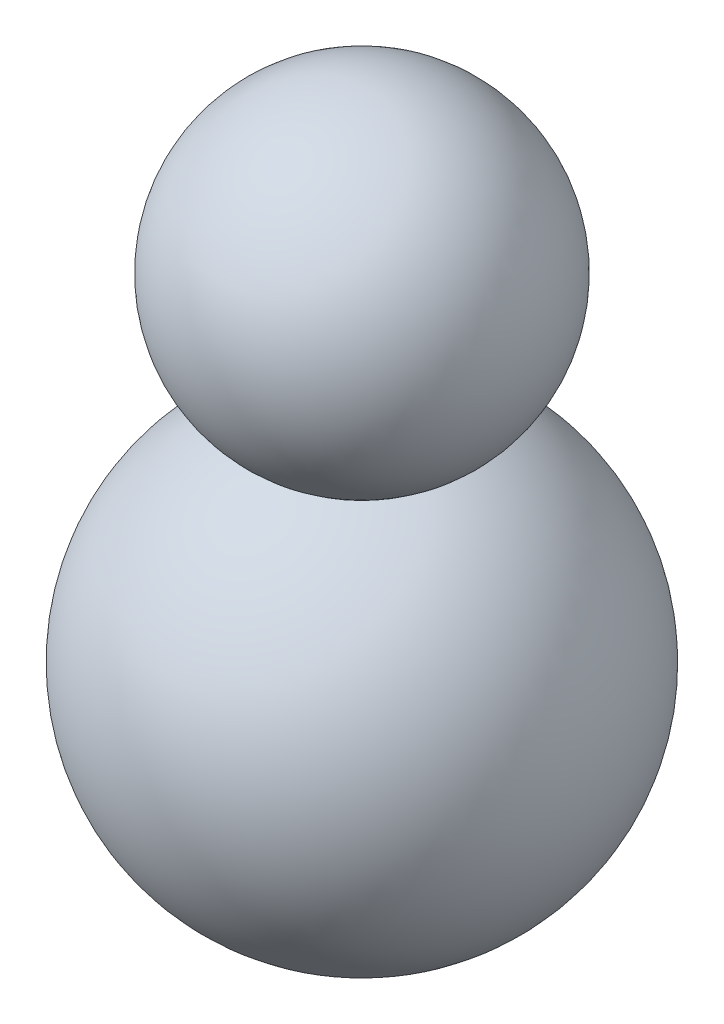
ISO-10303-21;
HEADER;
FILE_DESCRIPTION(('STEP AP214'),'2;1');
FILE_NAME('part.step','',(''),(''),'','','');
FILE_SCHEMA(('AUTOMOTIVE_DESIGN { 1 0 10303 214 1 1 1 1 }'));
ENDSEC;
DATA;
#1=APPLICATION_CONTEXT('core data for automotive mechanical design processes');
#2=APPLICATION_PROTOCOL_DEFINITION('international standard','automotive_design',2000,#1);
#3=PRODUCT_CONTEXT('',#1,'mechanical');
#4=PRODUCT('Part','Part','',(#3));
#5=PRODUCT_RELATED_PRODUCT_CATEGORY('part','',(#4));
#6=PRODUCT_DEFINITION_FORMATION('','',#4);
#7=PRODUCT_DEFINITION_CONTEXT('part definition',#1,'design');
#8=PRODUCT_DEFINITION('design','',#6,#7);
#9=PRODUCT_DEFINITION_SHAPE('','',#8);
#10=(LENGTH_UNIT() NAMED_UNIT(*) SI_UNIT(.MILLI.,.METRE.));
#11=(NAMED_UNIT(*) PLANE_ANGLE_UNIT() SI_UNIT($,.RADIAN.));
#12=(NAMED_UNIT(*) SI_UNIT($,.STERADIAN.) SOLID_ANGLE_UNIT());
#13=UNCERTAINTY_MEASURE_WITH_UNIT(LENGTH_MEASURE(1.E-05),#10,'distance_accuracy_value','');
#14=(GEOMETRIC_REPRESENTATION_CONTEXT(3) GLOBAL_UNCERTAINTY_ASSIGNED_CONTEXT((#13)) GLOBAL_UNIT_ASSIGNED_CONTEXT((#10,
#11,#12)) REPRESENTATION_CONTEXT('',''));
#15=CARTESIAN_POINT('',(0.,0.,0.));
#16=DIRECTION('',(0.,0.,1.));
#17=DIRECTION('',(1.,0.,0.));
#18=AXIS2_PLACEMENT_3D('',#15,#16,#17);
#19=CARTESIAN_POINT('',(0.,12.5,0.));
#20=DIRECTION('',(0.,-1.,0.));
#21=DIRECTION('',(-1.,0.,0.));
#22=AXIS2_PLACEMENT_3D('',#19,#20,#21);
#23=SPHERICAL_SURFACE('',#22,12.5);
#24=CARTESIAN_POINT('',(0.,23.9253040681417,0.));
#25=DIRECTION('',(0.,1.,0.));
#26=DIRECTION('',(-1.,0.,0.));
#27=AXIS2_PLACEMENT_3D('',#24,#25,#26);
#28=CIRCLE('',#27,5.07074224847845);
#29=CARTESIAN_POINT('',(-5.07074224847845,23.9253040681417,0.));
#30=VERTEX_POINT('',#29);
#31=EDGE_CURVE('E10',#30,#30,#28,.T.);
#32=ORIENTED_EDGE('',*,*,#31,.F.);
#33=EDGE_LOOP('',(#32));
#34=FACE_BOUND('',#33,.T.);
#35=ADVANCED_FACE('F42',(#34),#23,.T.);
#36=CARTESIAN_POINT('',(0.,31.3608654490662,0.));
#37=DIRECTION('',(0.,-1.,0.));
#38=DIRECTION('',(-1.,0.,0.));
#39=AXIS2_PLACEMENT_3D('',#36,#37,#38);
#40=SPHERICAL_SURFACE('',#39,9.);
#41=ORIENTED_EDGE('',*,*,#31,.T.);
#42=EDGE_LOOP('',(#41));
#43=FACE_BOUND('',#42,.T.);
#44=ADVANCED_FACE('F92',(#43),#40,.T.);
#45=CLOSED_SHELL('',(#35,#44));
#46=CARTESIAN_POINT('',(0.,12.5,0.));
#47=DIRECTION('',(0.,-1.,0.));
#48=DIRECTION('',(1.,0.,0.));
#49=AXIS2_PLACEMENT_3D('',#46,#47,#48);
#50=SPHERICAL_SURFACE('',#49,9.5);
#51=CARTESIAN_POINT('',(0.,3.48612181134003,0.));
#52=DIRECTION('',(0.,-1.,0.));
#53=DIRECTION('',(0.,0.,-1.));
#54=AXIS2_PLACEMENT_3D('',#51,#52,#53);
#55=CIRCLE('',#54,3.);
#56=CARTESIAN_POINT('',(3.,3.48612181134002,0.));
#57=VERTEX_POINT('',#56);
#58=EDGE_CURVE('E52',#57,#57,#55,.T.);
#59=CARTESIAN_POINT('',(0.,21.51387818866,0.));
#60=DIRECTION('',(0.,-1.,0.));
#61=DIRECTION('',(0.,0.,-1.));
#62=AXIS2_PLACEMENT_3D('',#59,#60,#61);
#63=CIRCLE('',#62,3.);
#64=CARTESIAN_POINT('',(2.99999999999999,21.51387818866,0.));
#65=VERTEX_POINT('',#64);
#66=EDGE_CURVE('E48',#65,#65,#63,.T.);
#67=CARTESIAN_POINT('',(3.,3.48612181134002,0.));
#68=CARTESIAN_POINT('',(3.23465214477344,3.56419654445642,0.));
#69=CARTESIAN_POINT('',(3.46623914099379,3.65147185330825,0.));
#70=CARTESIAN_POINT('',(3.92190725639522,3.84380613202532,0.));
#71=CARTESIAN_POINT('',(4.1459883755763,3.94886510189057,0.));
#72=CARTESIAN_POINT('',(4.58526915696609,4.17614921217708,0.));
#73=CARTESIAN_POINT('',(4.80046881917479,4.29837435259834,0.));
#74=CARTESIAN_POINT('',(5.22067750404172,4.5592396289506,0.));
#75=CARTESIAN_POINT('',(5.42568652669995,4.6978797648816,0.));
#76=CARTESIAN_POINT('',(5.82426358314594,4.99073158072201,0.));
#77=CARTESIAN_POINT('',(6.0178316169337,5.14494326063141,0.));
#78=CARTESIAN_POINT('',(6.39234696631903,5.46799770940088,0.));
#79=CARTESIAN_POINT('',(6.57329428191659,5.63684047826094,0.));
#80=CARTESIAN_POINT('',(6.92146516073721,5.98812802327498,0.));
#81=CARTESIAN_POINT('',(7.08868872396027,6.17057279942896,0.));
#82=CARTESIAN_POINT('',(7.40839278169045,6.5479522151094,0.));
#83=CARTESIAN_POINT('',(7.56087327619757,6.74288685463587,0.));
#84=CARTESIAN_POINT('',(7.85016173122487,7.14405775991769,0.));
#85=CARTESIAN_POINT('',(7.98696969174506,7.35029402567305,0.));
#86=CARTESIAN_POINT('',(8.2440791517263,7.77281104520842,0.));
#87=CARTESIAN_POINT('',(8.36438065118736,7.98909179898843,0.));
#88=CARTESIAN_POINT('',(8.58774387771863,8.43037943196335,0.));
#89=CARTESIAN_POINT('',(8.69080560478884,8.65538631115825,0.));
#90=CARTESIAN_POINT('',(8.87906106246881,9.11275464052029,0.));
#91=CARTESIAN_POINT('',(8.96425479307858,9.34511609068742,0.));
#92=CARTESIAN_POINT('',(9.11625495002638,9.81577717715853,0.));
#93=CARTESIAN_POINT('',(9.18306137636442,10.0540768134625,0.));
#94=CARTESIAN_POINT('',(9.29787969882455,10.5351616904472,0.));
#95=CARTESIAN_POINT('',(9.34589159494665,10.7779469311278,0.));
#96=CARTESIAN_POINT('',(9.42282819515883,11.2665230926238,0.));
#97=CARTESIAN_POINT('',(9.45175289924891,11.512314013439,0.));
#98=CARTESIAN_POINT('',(9.4903388016695,12.0054032895028,0.));
#99=CARTESIAN_POINT('',(9.5,12.2527016447514,0.));
#100=CARTESIAN_POINT('',(9.5,12.7472983552486,0.));
#101=CARTESIAN_POINT('',(9.4903388016695,12.9945967104972,0.));
#102=CARTESIAN_POINT('',(9.45175289924891,13.487685986561,0.));
#103=CARTESIAN_POINT('',(9.42282819515883,13.7334769073762,0.));
#104=CARTESIAN_POINT('',(9.34589159494665,14.2220530688722,0.));
#105=CARTESIAN_POINT('',(9.29787969882455,14.4648383095529,0.));
#106=CARTESIAN_POINT('',(9.18306137636442,14.9459231865375,0.));
#107=CARTESIAN_POINT('',(9.11625495002638,15.1842228228415,0.));
#108=CARTESIAN_POINT('',(8.96425479307857,15.6548839093126,0.));
#109=CARTESIAN_POINT('',(8.87906106246881,15.8872453594797,0.));
#110=CARTESIAN_POINT('',(8.69080560478883,16.3446136888418,0.));
#111=CARTESIAN_POINT('',(8.58774387771862,16.5696205680367,0.));
#112=CARTESIAN_POINT('',(8.36438065118736,17.0109082010116,0.));
#113=CARTESIAN_POINT('',(8.2440791517263,17.2271889547916,0.));
#114=CARTESIAN_POINT('',(7.98696969174505,17.649705974327,0.));
#115=CARTESIAN_POINT('',(7.85016173122487,17.8559422400823,0.));
#116=CARTESIAN_POINT('',(7.56087327619757,18.2571131453641,0.));
#117=CARTESIAN_POINT('',(7.40839278169045,18.4520477848906,0.));
#118=CARTESIAN_POINT('',(7.08868872396026,18.8294272005711,0.));
#119=CARTESIAN_POINT('',(6.9214651607372,19.011871976725,0.));
#120=CARTESIAN_POINT('',(6.57329428191658,19.3631595217391,0.));
#121=CARTESIAN_POINT('',(6.39234696631902,19.5320022905991,0.));
#122=CARTESIAN_POINT('',(6.0178316169337,19.8550567393686,0.));
#123=CARTESIAN_POINT('',(5.82426358314593,20.009268419278,0.));
#124=CARTESIAN_POINT('',(5.42568652669994,20.3021202351184,0.));
#125=CARTESIAN_POINT('',(5.22067750404172,20.4407603710494,0.));
#126=CARTESIAN_POINT('',(4.80046881917479,20.7016256474017,0.));
#127=CARTESIAN_POINT('',(4.58526915696608,20.8238507878229,0.));
#128=CARTESIAN_POINT('',(4.14598837557629,21.0511348981094,0.));
#129=CARTESIAN_POINT('',(3.92190725639521,21.1561938679747,0.));
#130=CARTESIAN_POINT('',(3.46623914099378,21.3485281466918,0.));
#131=CARTESIAN_POINT('',(3.23465214477343,21.4358034555436,0.));
#132=CARTESIAN_POINT('',(2.99999999999999,21.51387818866,0.));
#133=B_SPLINE_CURVE_WITH_KNOTS('',3,(#67,#68,#69,#70,#71,#72,#73,#74,#75,#76,#77,#78,#79,#80,
#81,#82,#83,#84,#85,#86,#87,#88,#89,#90,#91,#92,#93,#94,#95,#96,#97,#98,#99,#100,#101,#102,#103,
#104,#105,#106,#107,#108,#109,#110,#111,#112,#113,#114,#115,#116,#117,#118,#119,#120,#121,#122,
#123,#124,#125,#126,#127,#128,#129,#130,#131,#132),.UNSPECIFIED.,.F.,.F.,(4,2,2,2,2,2,2,2,2,2,2,
2,2,2,2,2,2,2,2,2,2,2,2,2,2,2,2,2,2,2,2,2,4),(0.,0.74170670839296,1.48341341678592,
2.22512012517888,2.96682683357184,3.7085335419648,4.45024025035775,5.19194695875071,
5.93365366714367,6.67536037553663,7.41706708392959,8.15877379232255,8.90048050071551,
9.64218720910847,10.3838939175014,11.1256006258944,11.8673073342874,12.6090140426803,
13.3507207510733,14.0924274594662,14.8341341678592,15.5758408762521,16.3175475846451,
17.0592542930381,17.800961001431,18.542667709824,19.2843744182169,20.0260811266099,
20.7677878350029,21.5094945433958,22.2512012517888,22.9929079601817,23.7346146685747),.UNSPECIFIED.);
#134=EDGE_CURVE('BSEAM83',#57,#65,#133,.T.);
#135=ORIENTED_EDGE('',*,*,#58,.T.);
#136=ORIENTED_EDGE('',*,*,#66,.F.);
#137=ORIENTED_EDGE('',*,*,#134,.T.);
#138=ORIENTED_EDGE('',*,*,#134,.F.);
#139=EDGE_LOOP('',(#135,#137,#136,#138));
#140=FACE_BOUND('',#139,.T.);
#141=ADVANCED_FACE('F83',(#140),#50,.F.);
#142=CARTESIAN_POINT('',(0.,0.,0.));
#143=DIRECTION('',(0.,-1.,0.));
#144=DIRECTION('',(0.,0.,-1.));
#145=AXIS2_PLACEMENT_3D('',#142,#143,#144);
#146=CYLINDRICAL_SURFACE('',#145,3.);
#147=ORIENTED_EDGE('',*,*,#66,.T.);
#148=EDGE_LOOP('',(#147));
#149=FACE_BOUND('',#148,.T.);
#150=ORIENTED_EDGE('',*,*,#58,.F.);
#151=EDGE_LOOP('',(#150));
#152=FACE_BOUND('',#151,.T.);
#153=ADVANCED_FACE('F85',(#149,#152),#146,.T.);
#154=CLOSED_SHELL('',(#141,#153));
#155=CARTESIAN_POINT('',(0.,31.3608654490662,0.));
#156=DIRECTION('',(0.,-1.,0.));
#157=DIRECTION('',(-1.,0.,0.));
#158=AXIS2_PLACEMENT_3D('',#155,#156,#157);
#159=SPHERICAL_SURFACE('',#158,6.);
#160=CARTESIAN_POINT('',(0.,26.1647130263593,0.));
#161=DIRECTION('',(0.,-1.,0.));
#162=DIRECTION('',(1.,0.,0.));
#163=AXIS2_PLACEMENT_3D('',#160,#161,#162);
#164=CIRCLE('',#163,3.);
#165=CARTESIAN_POINT('',(-2.99999999999949,26.1647130263593,0.));
#166=VERTEX_POINT('',#165);
#167=EDGE_CURVE('E56',#166,#166,#164,.T.);
#168=CARTESIAN_POINT('',(0.,36.5570178717731,0.));
#169=DIRECTION('',(0.,-1.,0.));
#170=DIRECTION('',(1.,0.,0.));
#171=AXIS2_PLACEMENT_3D('',#168,#169,#170);
#172=CIRCLE('',#171,3.);
#173=CARTESIAN_POINT('',(-2.99999999999951,36.5570178717731,0.));
#174=VERTEX_POINT('',#173);
#175=EDGE_CURVE('E61',#174,#174,#172,.T.);
#176=CARTESIAN_POINT('',(-2.99999999999949,26.1647130263593,0.));
#177=CARTESIAN_POINT('',(-3.1133661097812,26.2301573874406,0.));
#178=CARTESIAN_POINT('',(-3.22458327246442,26.2993223410809,0.));
#179=CARTESIAN_POINT('',(-3.4422595237699,26.4447732094203,0.));
#180=CARTESIAN_POINT('',(-3.54871861239215,26.5210591241194,0.));
#181=CARTESIAN_POINT('',(-3.75641853571168,26.6804316905175,0.));
#182=CARTESIAN_POINT('',(-3.85765937040897,26.7635183422165,0.));
#183=CARTESIAN_POINT('',(-4.05449041079114,26.9361348661676,0.));
#184=CARTESIAN_POINT('',(-4.15008061647604,27.0256647384198,0.));
#185=CARTESIAN_POINT('',(-4.3352007577619,27.2107847854735,0.));
#186=CARTESIAN_POINT('',(-4.42473069336286,27.306374960275,0.));
#187=CARTESIAN_POINT('',(-4.59734699638433,27.503206156656,0.));
#188=CARTESIAN_POINT('',(-4.68043336380484,27.6044471782354,0.));
#189=CARTESIAN_POINT('',(-4.83980671968953,27.8121465717918,0.));
#190=CARTESIAN_POINT('',(-4.91609370815371,27.9186049437689,0.));
#191=CARTESIAN_POINT('',(-5.06154163947646,28.1362831581277,0.));
#192=CARTESIAN_POINT('',(-5.13070258233503,28.2475030005094,0.));
#193=CARTESIAN_POINT('',(-5.26160226307794,28.4742278976225,0.));
#194=CARTESIAN_POINT('',(-5.32334100096227,28.5897329523538,0.));
#195=CARTESIAN_POINT('',(-5.43913189742976,28.8245336631501,0.));
#196=CARTESIAN_POINT('',(-5.49318405601292,28.9438293192151,0.));
#197=CARTESIAN_POINT('',(-5.59337033412235,29.1857003905359,0.));
#198=CARTESIAN_POINT('',(-5.63950445364863,29.3082758057918,0.));
#199=CARTESIAN_POINT('',(-5.72365710029252,29.5561815087024,0.));
#200=CARTESIAN_POINT('',(-5.76167562741012,29.6815117963571,0.));
#201=CARTESIAN_POINT('',(-5.82943428805862,29.9343905605448,0.));
#202=CARTESIAN_POINT('',(-5.85917442158951,30.0619390370778,0.));
#203=CARTESIAN_POINT('',(-5.91024894324921,30.3187079968608,0.));
#204=CARTESIAN_POINT('',(-5.93158333137802,30.4479284801108,0.));
#205=CARTESIAN_POINT('',(-5.96575500510769,30.7074881113809,0.));
#206=CARTESIAN_POINT('',(-5.97859229070854,30.8378272594011,0.));
#207=CARTESIAN_POINT('',(-5.9957147881547,31.0990660879696,0.));
#208=CARTESIAN_POINT('',(-6.,31.2299657685179,0.));
#209=CARTESIAN_POINT('',(-6.,31.4917651296145,0.));
#210=CARTESIAN_POINT('',(-5.9957147881547,31.6226648101628,0.));
#211=CARTESIAN_POINT('',(-5.97859229070854,31.8839036387313,0.));
#212=CARTESIAN_POINT('',(-5.96575500510769,32.0142427867515,0.));
#213=CARTESIAN_POINT('',(-5.93158333137802,32.2738024180217,0.));
#214=CARTESIAN_POINT('',(-5.91024894324921,32.4030229012716,0.));
#215=CARTESIAN_POINT('',(-5.85917442158951,32.6597918610546,0.));
#216=CARTESIAN_POINT('',(-5.82943428805862,32.7873403375876,0.));
#217=CARTESIAN_POINT('',(-5.76167562741013,33.0402191017753,0.));
#218=CARTESIAN_POINT('',(-5.72365710029252,33.16554938943,0.));
#219=CARTESIAN_POINT('',(-5.63950445364864,33.4134550923406,0.));
#220=CARTESIAN_POINT('',(-5.59337033412236,33.5360305075965,0.));
#221=CARTESIAN_POINT('',(-5.49318405601292,33.7779015789174,0.));
#222=CARTESIAN_POINT('',(-5.43913189742977,33.8971972349823,0.));
#223=CARTESIAN_POINT('',(-5.32334100096228,34.1319979457786,0.));
#224=CARTESIAN_POINT('',(-5.26160226307795,34.2475030005099,0.));
#225=CARTESIAN_POINT('',(-5.13070258233504,34.474227897623,0.));
#226=CARTESIAN_POINT('',(-5.06154163947647,34.5854477400047,0.));
#227=CARTESIAN_POINT('',(-4.91609370815372,34.8031259543635,0.));
#228=CARTESIAN_POINT('',(-4.83980671968954,34.9095843263406,0.));
#229=CARTESIAN_POINT('',(-4.68043336380485,35.1172837198971,0.));
#230=CARTESIAN_POINT('',(-4.59734699638434,35.2185247414764,0.));
#231=CARTESIAN_POINT('',(-4.42473069336287,35.4153559378574,0.));
#232=CARTESIAN_POINT('',(-4.33520075776191,35.5109461126589,0.));
#233=CARTESIAN_POINT('',(-4.15008061647606,35.6960661597127,0.));
#234=CARTESIAN_POINT('',(-4.05449041079116,35.7855960319648,0.));
#235=CARTESIAN_POINT('',(-3.85765937040898,35.9582125559159,0.));
#236=CARTESIAN_POINT('',(-3.7564185357117,36.0412992076149,0.));
#237=CARTESIAN_POINT('',(-3.54871861239216,36.200671774013,0.));
#238=CARTESIAN_POINT('',(-3.44225952376991,36.2769576887121,0.));
#239=CARTESIAN_POINT('',(-3.22458327246443,36.4224085570515,0.));
#240=CARTESIAN_POINT('',(-3.11336610978121,36.4915735106918,0.));
#241=CARTESIAN_POINT('',(-2.99999999999951,36.5570178717731,0.));
#242=B_SPLINE_CURVE_WITH_KNOTS('',3,(#176,#177,#178,#179,#180,#181,#182,#183,#184,#185,#186,
#187,#188,#189,#190,#191,#192,#193,#194,#195,#196,#197,#198,#199,#200,#201,#202,#203,#204,#205,
#206,#207,#208,#209,#210,#211,#212,#213,#214,#215,#216,#217,#218,#219,#220,#221,#222,#223,#224,
#225,#226,#227,#228,#229,#230,#231,#232,#233,#234,#235,#236,#237,#238,#239,#240,#241),
.UNSPECIFIED.,.F.,.F.,(4,2,2,2,2,2,2,2,2,2,2,2,2,2,2,2,2,2,2,2,2,2,2,2,2,2,2,2,2,2,2,2,4),(0.,
0.39262899386135,0.785257987722702,1.17788698158405,1.5705159754454,1.96314496930675,
2.3557739631681,2.74840295702945,3.1410319508908,3.53366094475215,3.9262899386135,
4.31891893247485,4.7115479263362,5.10417692019755,5.4968059140589,5.88943490792025,
6.2820639017816,6.67469289564294,7.0673218895043,7.45995088336565,7.852579877227,
8.24520887108835,8.6378378649497,9.03046685881105,9.4230958526724,9.81572484653374,
10.2083538403951,10.6009828342564,10.9936118281178,11.3862408219791,11.7788698158405,
12.1714988097018,12.5641278035632),.UNSPECIFIED.);
#243=EDGE_CURVE('BSEAM68',#166,#174,#242,.T.);
#244=ORIENTED_EDGE('',*,*,#167,.T.);
#245=ORIENTED_EDGE('',*,*,#175,.F.);
#246=ORIENTED_EDGE('',*,*,#243,.T.);
#247=ORIENTED_EDGE('',*,*,#243,.F.);
#248=EDGE_LOOP('',(#244,#246,#245,#247));
#249=FACE_BOUND('',#248,.T.);
#250=ADVANCED_FACE('F68',(#249),#159,.F.);
#251=CARTESIAN_POINT('',(0.,22.3608654490662,0.));
#252=DIRECTION('',(0.,-1.,0.));
#253=DIRECTION('',(1.,0.,0.));
#254=AXIS2_PLACEMENT_3D('',#251,#252,#253);
#255=CYLINDRICAL_SURFACE('',#254,3.);
#256=ORIENTED_EDGE('',*,*,#175,.T.);
#257=EDGE_LOOP('',(#256));
#258=FACE_BOUND('',#257,.T.);
#259=ORIENTED_EDGE('',*,*,#167,.F.);
#260=EDGE_LOOP('',(#259));
#261=FACE_BOUND('',#260,.T.);
#262=ADVANCED_FACE('F65',(#258,#261),#255,.T.);
#263=CLOSED_SHELL('',(#250,#262));
#264=ORIENTED_CLOSED_SHELL('',*,#154,.T.);
#265=ORIENTED_CLOSED_SHELL('',*,#263,.T.);
#266=BREP_WITH_VOIDS('B2',#45,(#264,#265));
#267=ADVANCED_BREP_SHAPE_REPRESENTATION('',(#18,#266),#14);
#268=SHAPE_DEFINITION_REPRESENTATION(#9,#267);
ENDSEC;
END-ISO-10303-21;
